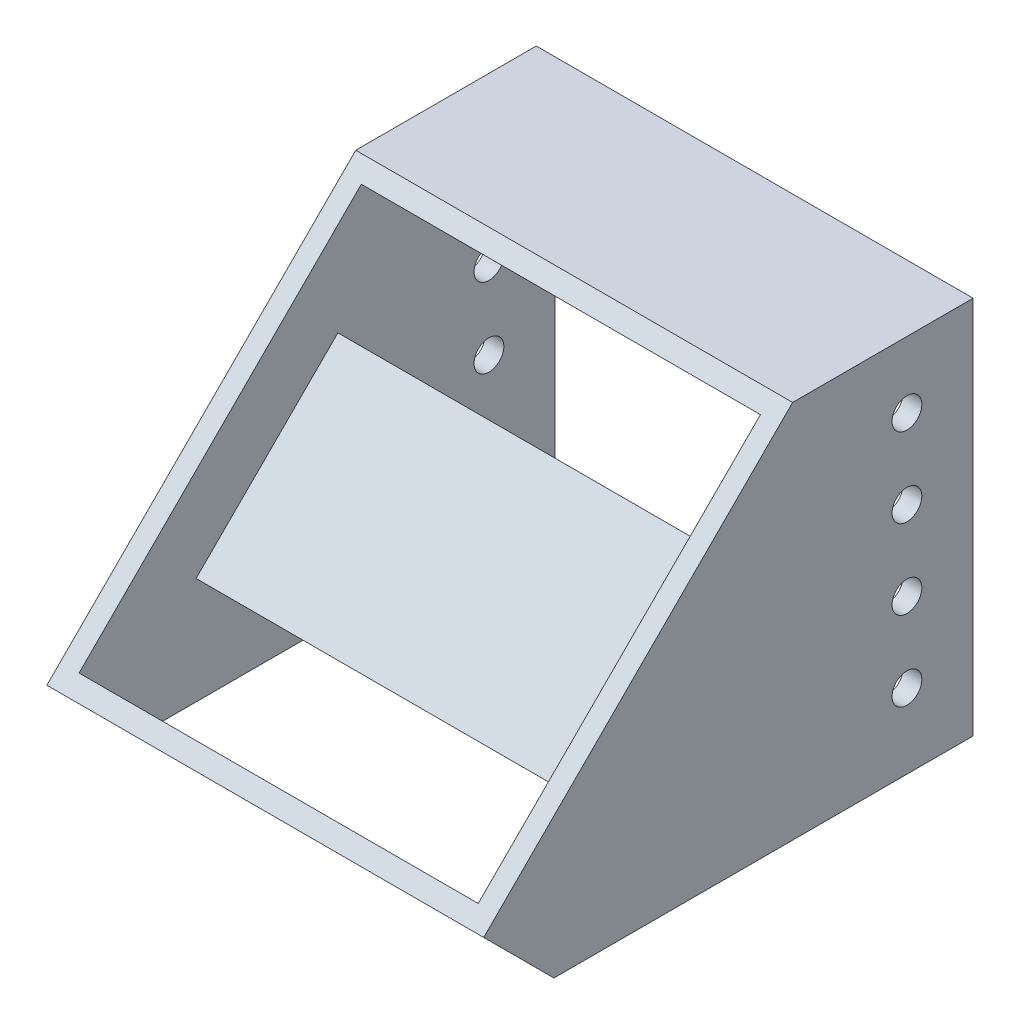
ISO-10303-21;
HEADER;
FILE_DESCRIPTION(('STEP AP214'),'2;1');
FILE_NAME('part.step','',(''),(''),'','','');
FILE_SCHEMA(('AUTOMOTIVE_DESIGN { 1 0 10303 214 1 1 1 1 }'));
ENDSEC;
DATA;
#1=APPLICATION_CONTEXT('core data for automotive mechanical design processes');
#2=APPLICATION_PROTOCOL_DEFINITION('international standard','automotive_design',2000,#1);
#3=PRODUCT_CONTEXT('',#1,'mechanical');
#4=PRODUCT('Part','Part','',(#3));
#5=PRODUCT_RELATED_PRODUCT_CATEGORY('part','',(#4));
#6=PRODUCT_DEFINITION_FORMATION('','',#4);
#7=PRODUCT_DEFINITION_CONTEXT('part definition',#1,'design');
#8=PRODUCT_DEFINITION('design','',#6,#7);
#9=PRODUCT_DEFINITION_SHAPE('','',#8);
#10=(LENGTH_UNIT() NAMED_UNIT(*) SI_UNIT(.MILLI.,.METRE.));
#11=(NAMED_UNIT(*) PLANE_ANGLE_UNIT() SI_UNIT($,.RADIAN.));
#12=(NAMED_UNIT(*) SI_UNIT($,.STERADIAN.) SOLID_ANGLE_UNIT());
#13=UNCERTAINTY_MEASURE_WITH_UNIT(LENGTH_MEASURE(1.E-05),#10,'distance_accuracy_value','');
#14=(GEOMETRIC_REPRESENTATION_CONTEXT(3) GLOBAL_UNCERTAINTY_ASSIGNED_CONTEXT((#13)) GLOBAL_UNIT_ASSIGNED_CONTEXT((#10,
#11,#12)) REPRESENTATION_CONTEXT('',''));
#15=CARTESIAN_POINT('',(0.,0.,0.));
#16=DIRECTION('',(0.,0.,1.));
#17=DIRECTION('',(1.,0.,0.));
#18=AXIS2_PLACEMENT_3D('',#15,#16,#17);
#19=CARTESIAN_POINT('',(-30.15,31.9258711705726,-10.7126677349762));
#20=DIRECTION('',(1.,0.,0.));
#21=DIRECTION('',(0.,0.,-1.));
#22=AXIS2_PLACEMENT_3D('',#19,#20,#21);
#23=PLANE('',#22);
#24=CARTESIAN_POINT('',(-30.15,23.9411254969543,-30.));
#25=DIRECTION('',(1.,0.,0.));
#26=DIRECTION('',(0.,0.,-1.));
#27=AXIS2_PLACEMENT_3D('',#24,#25,#26);
#28=CIRCLE('',#27,2.25);
#29=CARTESIAN_POINT('',(-30.15,23.9411254969543,-32.25));
#30=VERTEX_POINT('',#29);
#31=EDGE_CURVE('E166',#30,#30,#28,.T.);
#32=ORIENTED_EDGE('',*,*,#31,.F.);
#33=EDGE_LOOP('',(#32));
#34=FACE_BOUND('',#33,.T.);
#35=CARTESIAN_POINT('',(-30.15,-0.0588745030457236,-30.));
#36=DIRECTION('',(1.,0.,0.));
#37=DIRECTION('',(0.,0.,-1.));
#38=AXIS2_PLACEMENT_3D('',#35,#36,#37);
#39=CIRCLE('',#38,2.25);
#40=CARTESIAN_POINT('',(-30.15,-0.0588745030457236,-32.25));
#41=VERTEX_POINT('',#40);
#42=EDGE_CURVE('E294',#41,#41,#39,.T.);
#43=ORIENTED_EDGE('',*,*,#42,.F.);
#44=EDGE_LOOP('',(#43));
#45=FACE_BOUND('',#44,.T.);
#46=CARTESIAN_POINT('',(-30.15,11.9411254969543,-30.));
#47=DIRECTION('',(1.,0.,0.));
#48=DIRECTION('',(0.,0.,-1.));
#49=AXIS2_PLACEMENT_3D('',#46,#47,#48);
#50=CIRCLE('',#49,2.25);
#51=CARTESIAN_POINT('',(-30.15,11.9411254969543,-32.25));
#52=VERTEX_POINT('',#51);
#53=EDGE_CURVE('E303',#52,#52,#50,.T.);
#54=ORIENTED_EDGE('',*,*,#53,.F.);
#55=EDGE_LOOP('',(#54));
#56=FACE_BOUND('',#55,.T.);
#57=CARTESIAN_POINT('',(-30.15,-12.0588745030457,-30.));
#58=DIRECTION('',(1.,0.,0.));
#59=DIRECTION('',(0.,0.,-1.));
#60=AXIS2_PLACEMENT_3D('',#57,#58,#59);
#61=CIRCLE('',#60,2.25);
#62=CARTESIAN_POINT('',(-30.15,-12.0588745030457,-32.25));
#63=VERTEX_POINT('',#62);
#64=EDGE_CURVE('E312',#63,#63,#61,.T.);
#65=ORIENTED_EDGE('',*,*,#64,.F.);
#66=EDGE_LOOP('',(#65));
#67=FACE_BOUND('',#66,.T.);
#68=DIRECTION('',(0.,0.,-1.));
#69=VECTOR('',#68,1.);
#70=CARTESIAN_POINT('',(-30.15,30.9411254969543,62.660050782245));
#71=LINE('',#70,#69);
#72=CARTESIAN_POINT('',(-30.15,30.9411254969543,-11.6974134085946));
#73=VERTEX_POINT('',#72);
#74=CARTESIAN_POINT('',(-30.15,30.9411254969543,-40.));
#75=VERTEX_POINT('',#74);
#76=EDGE_CURVE('E50',#73,#75,#71,.T.);
#77=ORIENTED_EDGE('',*,*,#76,.F.);
#78=DIRECTION('',(0.,-0.707106781186548,-0.707106781186548));
#79=VECTOR('',#78,1.);
#80=CARTESIAN_POINT('',(-30.15,31.9258711705726,-10.7126677349762));
#81=LINE('',#80,#79);
#82=CARTESIAN_POINT('',(-30.15,31.9258711705726,-10.7126677349762));
#83=VERTEX_POINT('',#82);
#84=EDGE_CURVE('E165',#83,#73,#81,.T.);
#85=ORIENTED_EDGE('',*,*,#84,.F.);
#86=DIRECTION('',(0.,-0.707106781186547,0.707106781186547));
#87=VECTOR('',#86,1.);
#88=CARTESIAN_POINT('',(-30.15,31.9258711705726,-10.7126677349762));
#89=LINE('',#88,#87);
#90=CARTESIAN_POINT('',(-30.15,-10.7126677349762,31.9258711705726));
#91=VERTEX_POINT('',#90);
#92=EDGE_CURVE('E220',#83,#91,#89,.T.);
#93=ORIENTED_EDGE('',*,*,#92,.T.);
#94=DIRECTION('',(0.,-0.707106781186548,-0.707106781186548));
#95=VECTOR('',#94,1.);
#96=CARTESIAN_POINT('',(-30.15,-10.7126677349762,31.9258711705726));
#97=LINE('',#96,#95);
#98=CARTESIAN_POINT('',(-30.15,-21.3192694527744,21.3192694527744));
#99=VERTEX_POINT('',#98);
#100=EDGE_CURVE('E174',#91,#99,#97,.T.);
#101=ORIENTED_EDGE('',*,*,#100,.T.);
#102=DIRECTION('',(0.,0.707106781186548,-0.707106781186547));
#103=VECTOR('',#102,1.);
#104=CARTESIAN_POINT('',(-30.15,-31.960031650134,31.960031650134));
#105=LINE('',#104,#103);
#106=CARTESIAN_POINT('',(-30.15,-23.3345237791561,23.3345237791561));
#107=VERTEX_POINT('',#106);
#108=EDGE_CURVE('E242',#107,#99,#105,.T.);
#109=ORIENTED_EDGE('',*,*,#108,.F.);
#110=DIRECTION('',(0.,0.,-1.));
#111=VECTOR('',#110,1.);
#112=CARTESIAN_POINT('',(-30.15,-23.3345237791561,63.920063300268));
#113=LINE('',#112,#111);
#114=CARTESIAN_POINT('',(-30.15,-23.3345237791561,-40.));
#115=VERTEX_POINT('',#114);
#116=EDGE_CURVE('E250',#107,#115,#113,.T.);
#117=ORIENTED_EDGE('',*,*,#116,.T.);
#118=DIRECTION('',(0.,-1.,0.));
#119=VECTOR('',#118,1.);
#120=CARTESIAN_POINT('',(-30.15,0.,-40.));
#121=LINE('',#120,#119);
#122=EDGE_CURVE('E261',#75,#115,#121,.T.);
#123=ORIENTED_EDGE('',*,*,#122,.F.);
#124=EDGE_LOOP('',(#77,#85,#93,#101,#109,#117,#123));
#125=FACE_BOUND('',#124,.T.);
#126=CARTESIAN_POINT('',(-30.15,-10.7126677349762,10.7126677349762));
#127=VERTEX_POINT('',#126);
#128=CARTESIAN_POINT('',(-30.15,10.7126677349762,-10.7126677349762));
#129=VERTEX_POINT('',#128);
#130=EDGE_CURVE('E246',#127,#129,#105,.T.);
#131=ORIENTED_EDGE('',*,*,#130,.F.);
#132=DIRECTION('',(0.,0.707106781186548,0.707106781186548));
#133=VECTOR('',#132,1.);
#134=CARTESIAN_POINT('',(-30.15,-34.0471915141323,-12.6218560441799));
#135=LINE('',#134,#133);
#136=CARTESIAN_POINT('',(-30.15,-7.17713382904345,14.2482016409089));
#137=VERTEX_POINT('',#136);
#138=EDGE_CURVE('E237',#127,#137,#135,.T.);
#139=ORIENTED_EDGE('',*,*,#138,.T.);
#140=DIRECTION('',(0.,-0.707106781186547,0.707106781186547));
#141=VECTOR('',#140,1.);
#142=CARTESIAN_POINT('',(-30.15,24.8548033587072,-17.7837355468417));
#143=LINE('',#142,#141);
#144=CARTESIAN_POINT('',(-30.15,14.248201640909,-7.17713382904347));
#145=VERTEX_POINT('',#144);
#146=EDGE_CURVE('E211',#145,#137,#143,.T.);
#147=ORIENTED_EDGE('',*,*,#146,.F.);
#148=DIRECTION('',(0.,0.707106781186548,0.707106781186548));
#149=VECTOR('',#148,1.);
#150=CARTESIAN_POINT('',(-30.15,-12.6218560441799,-34.0471915141323));
#151=LINE('',#150,#149);
#152=EDGE_CURVE('E239',#129,#145,#151,.T.);
#153=ORIENTED_EDGE('',*,*,#152,.F.);
#154=EDGE_LOOP('',(#131,#139,#147,#153));
#155=FACE_BOUND('',#154,.T.);
#156=ADVANCED_FACE('F35',(#34,#45,#56,#67,#125,#155),#23,.T.);
#157=CARTESIAN_POINT('',(30.15,31.9258711705726,-10.7126677349762));
#158=DIRECTION('',(-1.,0.,0.));
#159=DIRECTION('',(0.,0.,1.));
#160=AXIS2_PLACEMENT_3D('',#157,#158,#159);
#161=PLANE('',#160);
#162=CARTESIAN_POINT('',(30.15,23.9411254969543,-30.));
#163=DIRECTION('',(-1.,0.,0.));
#164=DIRECTION('',(0.,0.,1.));
#165=AXIS2_PLACEMENT_3D('',#162,#163,#164);
#166=CIRCLE('',#165,2.25);
#167=CARTESIAN_POINT('',(30.15,23.9411254969543,-27.75));
#168=VERTEX_POINT('',#167);
#169=EDGE_CURVE('E288',#168,#168,#166,.T.);
#170=ORIENTED_EDGE('',*,*,#169,.F.);
#171=EDGE_LOOP('',(#170));
#172=FACE_BOUND('',#171,.T.);
#173=CARTESIAN_POINT('',(30.15,-0.0588745030457236,-30.));
#174=DIRECTION('',(-1.,0.,0.));
#175=DIRECTION('',(0.,0.,1.));
#176=AXIS2_PLACEMENT_3D('',#173,#174,#175);
#177=CIRCLE('',#176,2.25);
#178=CARTESIAN_POINT('',(30.15,-0.0588745030457236,-27.75));
#179=VERTEX_POINT('',#178);
#180=EDGE_CURVE('E297',#179,#179,#177,.T.);
#181=ORIENTED_EDGE('',*,*,#180,.F.);
#182=EDGE_LOOP('',(#181));
#183=FACE_BOUND('',#182,.T.);
#184=CARTESIAN_POINT('',(30.15,11.9411254969543,-30.));
#185=DIRECTION('',(-1.,0.,0.));
#186=DIRECTION('',(0.,0.,1.));
#187=AXIS2_PLACEMENT_3D('',#184,#185,#186);
#188=CIRCLE('',#187,2.25);
#189=CARTESIAN_POINT('',(30.15,11.9411254969543,-27.75));
#190=VERTEX_POINT('',#189);
#191=EDGE_CURVE('E306',#190,#190,#188,.T.);
#192=ORIENTED_EDGE('',*,*,#191,.F.);
#193=EDGE_LOOP('',(#192));
#194=FACE_BOUND('',#193,.T.);
#195=CARTESIAN_POINT('',(30.15,-12.0588745030457,-30.));
#196=DIRECTION('',(-1.,0.,0.));
#197=DIRECTION('',(0.,0.,1.));
#198=AXIS2_PLACEMENT_3D('',#195,#196,#197);
#199=CIRCLE('',#198,2.25);
#200=CARTESIAN_POINT('',(30.15,-12.0588745030457,-27.75));
#201=VERTEX_POINT('',#200);
#202=EDGE_CURVE('E315',#201,#201,#199,.T.);
#203=ORIENTED_EDGE('',*,*,#202,.F.);
#204=EDGE_LOOP('',(#203));
#205=FACE_BOUND('',#204,.T.);
#206=DIRECTION('',(0.,-0.707106781186548,-0.707106781186548));
#207=VECTOR('',#206,1.);
#208=CARTESIAN_POINT('',(30.15,31.9258711705726,-10.7126677349762));
#209=LINE('',#208,#207);
#210=CARTESIAN_POINT('',(30.15,31.9258711705726,-10.7126677349762));
#211=VERTEX_POINT('',#210);
#212=CARTESIAN_POINT('',(30.15,30.9411254969543,-11.6974134085946));
#213=VERTEX_POINT('',#212);
#214=EDGE_CURVE('E163',#211,#213,#209,.T.);
#215=ORIENTED_EDGE('',*,*,#214,.T.);
#216=DIRECTION('',(0.,0.,-1.));
#217=VECTOR('',#216,1.);
#218=CARTESIAN_POINT('',(30.15,30.9411254969543,62.660050782245));
#219=LINE('',#218,#217);
#220=CARTESIAN_POINT('',(30.15,30.9411254969543,-40.));
#221=VERTEX_POINT('',#220);
#222=EDGE_CURVE('E149',#213,#221,#219,.T.);
#223=ORIENTED_EDGE('',*,*,#222,.T.);
#224=DIRECTION('',(0.,-1.,0.));
#225=VECTOR('',#224,1.);
#226=CARTESIAN_POINT('',(30.15,0.,-40.));
#227=LINE('',#226,#225);
#228=CARTESIAN_POINT('',(30.15,-23.3345237791561,-40.));
#229=VERTEX_POINT('',#228);
#230=EDGE_CURVE('E279',#221,#229,#227,.T.);
#231=ORIENTED_EDGE('',*,*,#230,.T.);
#232=DIRECTION('',(0.,0.,-1.));
#233=VECTOR('',#232,1.);
#234=CARTESIAN_POINT('',(30.15,-23.3345237791561,63.920063300268));
#235=LINE('',#234,#233);
#236=CARTESIAN_POINT('',(30.15,-23.3345237791561,23.3345237791561));
#237=VERTEX_POINT('',#236);
#238=EDGE_CURVE('E271',#237,#229,#235,.T.);
#239=ORIENTED_EDGE('',*,*,#238,.F.);
#240=DIRECTION('',(0.,0.707106781186548,-0.707106781186547));
#241=VECTOR('',#240,1.);
#242=CARTESIAN_POINT('',(30.15,-31.960031650134,31.960031650134));
#243=LINE('',#242,#241);
#244=CARTESIAN_POINT('',(30.15,-21.3192694527744,21.3192694527744));
#245=VERTEX_POINT('',#244);
#246=EDGE_CURVE('E58',#237,#245,#243,.T.);
#247=ORIENTED_EDGE('',*,*,#246,.T.);
#248=DIRECTION('',(0.,-0.707106781186548,-0.707106781186548));
#249=VECTOR('',#248,1.);
#250=CARTESIAN_POINT('',(30.15,-10.7126677349762,31.9258711705726));
#251=LINE('',#250,#249);
#252=CARTESIAN_POINT('',(30.15,-10.7126677349762,31.9258711705726));
#253=VERTEX_POINT('',#252);
#254=EDGE_CURVE('E172',#253,#245,#251,.T.);
#255=ORIENTED_EDGE('',*,*,#254,.F.);
#256=DIRECTION('',(0.,0.707106781186547,-0.707106781186547));
#257=VECTOR('',#256,1.);
#258=CARTESIAN_POINT('',(30.15,31.9258711705726,-10.7126677349762));
#259=LINE('',#258,#257);
#260=EDGE_CURVE('E171',#253,#211,#259,.T.);
#261=ORIENTED_EDGE('',*,*,#260,.T.);
#262=EDGE_LOOP('',(#215,#223,#231,#239,#247,#255,#261));
#263=FACE_BOUND('',#262,.T.);
#264=CARTESIAN_POINT('',(30.15,-10.7126677349762,10.7126677349762));
#265=VERTEX_POINT('',#264);
#266=CARTESIAN_POINT('',(30.15,10.7126677349762,-10.7126677349762));
#267=VERTEX_POINT('',#266);
#268=EDGE_CURVE('E267',#265,#267,#243,.T.);
#269=ORIENTED_EDGE('',*,*,#268,.T.);
#270=DIRECTION('',(0.,0.707106781186548,0.707106781186548));
#271=VECTOR('',#270,1.);
#272=CARTESIAN_POINT('',(30.15,-12.6218560441799,-34.0471915141323));
#273=LINE('',#272,#271);
#274=CARTESIAN_POINT('',(30.15,14.248201640909,-7.17713382904347));
#275=VERTEX_POINT('',#274);
#276=EDGE_CURVE('E218',#267,#275,#273,.T.);
#277=ORIENTED_EDGE('',*,*,#276,.T.);
#278=DIRECTION('',(0.,0.707106781186547,-0.707106781186547));
#279=VECTOR('',#278,1.);
#280=CARTESIAN_POINT('',(30.15,24.8548033587072,-17.7837355468417));
#281=LINE('',#280,#279);
#282=CARTESIAN_POINT('',(30.15,-7.17713382904345,14.2482016409089));
#283=VERTEX_POINT('',#282);
#284=EDGE_CURVE('E209',#283,#275,#281,.T.);
#285=ORIENTED_EDGE('',*,*,#284,.F.);
#286=DIRECTION('',(0.,0.707106781186548,0.707106781186548));
#287=VECTOR('',#286,1.);
#288=CARTESIAN_POINT('',(30.15,-34.0471915141323,-12.6218560441799));
#289=LINE('',#288,#287);
#290=EDGE_CURVE('E216',#265,#283,#289,.T.);
#291=ORIENTED_EDGE('',*,*,#290,.F.);
#292=EDGE_LOOP('',(#269,#277,#285,#291));
#293=FACE_BOUND('',#292,.T.);
#294=ADVANCED_FACE('F168',(#172,#183,#194,#205,#263,#293),#161,.T.);
#295=CARTESIAN_POINT('',(0.,0.,0.));
#296=DIRECTION('',(0.,-0.707106781186547,-0.707106781186548));
#297=DIRECTION('',(0.,0.707106781186548,-0.707106781186547));
#298=AXIS2_PLACEMENT_3D('',#295,#296,#297);
#299=PLANE('',#298);
#300=DIRECTION('',(-1.,0.,0.));
#301=VECTOR('',#300,1.);
#302=CARTESIAN_POINT('',(0.,10.7126677349762,-10.7126677349762));
#303=LINE('',#302,#301);
#304=EDGE_CURVE('E223',#267,#129,#303,.T.);
#305=ORIENTED_EDGE('',*,*,#304,.F.);
#306=ORIENTED_EDGE('',*,*,#268,.F.);
#307=DIRECTION('',(1.,0.,0.));
#308=VECTOR('',#307,1.);
#309=CARTESIAN_POINT('',(0.,-10.7126677349762,10.7126677349762));
#310=LINE('',#309,#308);
#311=EDGE_CURVE('E231',#127,#265,#310,.T.);
#312=ORIENTED_EDGE('',*,*,#311,.F.);
#313=ORIENTED_EDGE('',*,*,#130,.T.);
#314=EDGE_LOOP('',(#305,#306,#312,#313));
#315=FACE_BOUND('',#314,.T.);
#316=ADVANCED_FACE('F364',(#315),#299,.T.);
#317=DIRECTION('',(-1.,0.,0.));
#318=VECTOR('',#317,1.);
#319=CARTESIAN_POINT('',(0.,-21.3192694527744,21.3192694527744));
#320=LINE('',#319,#318);
#321=EDGE_CURVE('E234',#245,#99,#320,.T.);
#322=ORIENTED_EDGE('',*,*,#321,.F.);
#323=ORIENTED_EDGE('',*,*,#246,.F.);
#324=DIRECTION('',(1.,0.,0.));
#325=VECTOR('',#324,1.);
#326=CARTESIAN_POINT('',(33.,-23.3345237791561,23.3345237791561));
#327=LINE('',#326,#325);
#328=EDGE_CURVE('E194',#107,#237,#327,.T.);
#329=ORIENTED_EDGE('',*,*,#328,.F.);
#330=ORIENTED_EDGE('',*,*,#108,.T.);
#331=EDGE_LOOP('',(#322,#323,#329,#330));
#332=FACE_BOUND('',#331,.T.);
#333=ADVANCED_FACE('F381',(#332),#299,.T.);
#334=CARTESIAN_POINT('',(-33.,26.8700576850888,-19.7989898732233));
#335=DIRECTION('',(1.,0.,0.));
#336=DIRECTION('',(0.,0.,-1.));
#337=AXIS2_PLACEMENT_3D('',#334,#335,#336);
#338=PLANE('',#337);
#339=CARTESIAN_POINT('',(-33.,23.9411254969543,-30.));
#340=DIRECTION('',(1.,0.,0.));
#341=DIRECTION('',(0.,0.,-1.));
#342=AXIS2_PLACEMENT_3D('',#339,#340,#341);
#343=CIRCLE('',#342,2.25);
#344=CARTESIAN_POINT('',(-33.,23.9411254969543,-32.25));
#345=VERTEX_POINT('',#344);
#346=EDGE_CURVE('E291',#345,#345,#343,.T.);
#347=ORIENTED_EDGE('',*,*,#346,.T.);
#348=EDGE_LOOP('',(#347));
#349=FACE_BOUND('',#348,.T.);
#350=CARTESIAN_POINT('',(-33.,-0.0588745030457236,-30.));
#351=DIRECTION('',(1.,0.,0.));
#352=DIRECTION('',(0.,0.,-1.));
#353=AXIS2_PLACEMENT_3D('',#350,#351,#352);
#354=CIRCLE('',#353,2.25);
#355=CARTESIAN_POINT('',(-33.,-0.0588745030457236,-32.25));
#356=VERTEX_POINT('',#355);
#357=EDGE_CURVE('E300',#356,#356,#354,.T.);
#358=ORIENTED_EDGE('',*,*,#357,.T.);
#359=EDGE_LOOP('',(#358));
#360=FACE_BOUND('',#359,.T.);
#361=CARTESIAN_POINT('',(-33.,11.9411254969543,-30.));
#362=DIRECTION('',(1.,0.,0.));
#363=DIRECTION('',(0.,0.,-1.));
#364=AXIS2_PLACEMENT_3D('',#361,#362,#363);
#365=CIRCLE('',#364,2.25);
#366=CARTESIAN_POINT('',(-33.,11.9411254969543,-32.25));
#367=VERTEX_POINT('',#366);
#368=EDGE_CURVE('E309',#367,#367,#365,.T.);
#369=ORIENTED_EDGE('',*,*,#368,.T.);
#370=EDGE_LOOP('',(#369));
#371=FACE_BOUND('',#370,.T.);
#372=CARTESIAN_POINT('',(-33.,-12.0588745030457,-30.));
#373=DIRECTION('',(1.,0.,0.));
#374=DIRECTION('',(0.,0.,-1.));
#375=AXIS2_PLACEMENT_3D('',#372,#373,#374);
#376=CIRCLE('',#375,2.25);
#377=CARTESIAN_POINT('',(-33.,-12.0588745030457,-32.25));
#378=VERTEX_POINT('',#377);
#379=EDGE_CURVE('E318',#378,#378,#376,.T.);
#380=ORIENTED_EDGE('',*,*,#379,.T.);
#381=EDGE_LOOP('',(#380));
#382=FACE_BOUND('',#381,.T.);
#383=DIRECTION('',(0.,-1.,0.));
#384=VECTOR('',#383,1.);
#385=CARTESIAN_POINT('',(-33.,0.,-40.));
#386=LINE('',#385,#384);
#387=CARTESIAN_POINT('',(-33.,33.9411254969543,-40.));
#388=VERTEX_POINT('',#387);
#389=CARTESIAN_POINT('',(-33.,-23.3345237791561,-40.));
#390=VERTEX_POINT('',#389);
#391=EDGE_CURVE('E256',#388,#390,#386,.T.);
#392=ORIENTED_EDGE('',*,*,#391,.T.);
#393=DIRECTION('',(0.,0.,-1.));
#394=VECTOR('',#393,1.);
#395=CARTESIAN_POINT('',(-33.,-23.3345237791561,63.920063300268));
#396=LINE('',#395,#394);
#397=CARTESIAN_POINT('',(-33.,-23.3345237791561,23.3345237791561));
#398=VERTEX_POINT('',#397);
#399=EDGE_CURVE('E247',#398,#390,#396,.T.);
#400=ORIENTED_EDGE('',*,*,#399,.F.);
#401=DIRECTION('',(0.,-0.707106781186547,-0.707106781186548));
#402=VECTOR('',#401,1.);
#403=CARTESIAN_POINT('',(-33.,-19.7989898732233,26.8700576850888));
#404=LINE('',#403,#402);
#405=CARTESIAN_POINT('',(-33.,-12.7279220613579,33.9411254969543));
#406=VERTEX_POINT('',#405);
#407=EDGE_CURVE('E201',#406,#398,#404,.T.);
#408=ORIENTED_EDGE('',*,*,#407,.F.);
#409=DIRECTION('',(0.,-0.707106781186547,0.707106781186547));
#410=VECTOR('',#409,1.);
#411=CARTESIAN_POINT('',(-33.,33.9411254969543,-12.7279220613578));
#412=LINE('',#411,#410);
#413=CARTESIAN_POINT('',(-33.,33.9411254969543,-12.7279220613578));
#414=VERTEX_POINT('',#413);
#415=EDGE_CURVE('E191',#414,#406,#412,.T.);
#416=ORIENTED_EDGE('',*,*,#415,.F.);
#417=DIRECTION('',(0.,0.,-1.));
#418=VECTOR('',#417,1.);
#419=CARTESIAN_POINT('',(-33.,33.9411254969543,63.920063300268));
#420=LINE('',#419,#418);
#421=EDGE_CURVE('E244',#414,#388,#420,.T.);
#422=ORIENTED_EDGE('',*,*,#421,.T.);
#423=EDGE_LOOP('',(#392,#400,#408,#416,#422));
#424=FACE_BOUND('',#423,.T.);
#425=ADVANCED_FACE('F37',(#349,#360,#371,#382,#424),#338,.F.);
#426=CARTESIAN_POINT('',(33.,-19.7989898732233,26.8700576850888));
#427=DIRECTION('',(0.,0.707106781186548,-0.707106781186547));
#428=DIRECTION('',(0.,0.707106781186547,0.707106781186548));
#429=AXIS2_PLACEMENT_3D('',#426,#427,#428);
#430=PLANE('',#429);
#431=EDGE_CURVE('E195',#398,#107,#327,.T.);
#432=ORIENTED_EDGE('',*,*,#431,.T.);
#433=ORIENTED_EDGE('',*,*,#328,.T.);
#434=DIRECTION('',(-1.,0.,0.));
#435=VECTOR('',#434,1.);
#436=CARTESIAN_POINT('',(0.,-23.334523779156,23.334523779156));
#437=LINE('',#436,#435);
#438=CARTESIAN_POINT('',(33.,-23.3345237791561,23.3345237791561));
#439=VERTEX_POINT('',#438);
#440=EDGE_CURVE('E264',#439,#237,#437,.T.);
#441=ORIENTED_EDGE('',*,*,#440,.F.);
#442=DIRECTION('',(0.,-0.707106781186547,-0.707106781186548));
#443=VECTOR('',#442,1.);
#444=CARTESIAN_POINT('',(33.,-19.7989898732233,26.8700576850888));
#445=LINE('',#444,#443);
#446=CARTESIAN_POINT('',(33.,-12.7279220613579,33.9411254969543));
#447=VERTEX_POINT('',#446);
#448=EDGE_CURVE('E198',#447,#439,#445,.T.);
#449=ORIENTED_EDGE('',*,*,#448,.F.);
#450=DIRECTION('',(1.,0.,0.));
#451=VECTOR('',#450,1.);
#452=CARTESIAN_POINT('',(-33.,-12.7279220613579,33.9411254969543));
#453=LINE('',#452,#451);
#454=EDGE_CURVE('E182',#406,#447,#453,.T.);
#455=ORIENTED_EDGE('',*,*,#454,.F.);
#456=ORIENTED_EDGE('',*,*,#407,.T.);
#457=EDGE_LOOP('',(#432,#433,#441,#449,#455,#456));
#458=FACE_BOUND('',#457,.T.);
#459=ADVANCED_FACE('F384',(#458),#430,.F.);
#460=CARTESIAN_POINT('',(33.,26.8700576850888,-19.7989898732233));
#461=DIRECTION('',(-1.,0.,0.));
#462=DIRECTION('',(0.,-1.,0.));
#463=AXIS2_PLACEMENT_3D('',#460,#461,#462);
#464=PLANE('',#463);
#465=CARTESIAN_POINT('',(33.,23.9411254969543,-30.));
#466=DIRECTION('',(-1.,0.,0.));
#467=DIRECTION('',(0.,0.,1.));
#468=AXIS2_PLACEMENT_3D('',#465,#466,#467);
#469=CIRCLE('',#468,2.25);
#470=CARTESIAN_POINT('',(33.,23.9411254969543,-27.75));
#471=VERTEX_POINT('',#470);
#472=EDGE_CURVE('E321',#471,#471,#469,.T.);
#473=ORIENTED_EDGE('',*,*,#472,.T.);
#474=EDGE_LOOP('',(#473));
#475=FACE_BOUND('',#474,.T.);
#476=CARTESIAN_POINT('',(33.,-0.0588745030457236,-30.));
#477=DIRECTION('',(-1.,0.,0.));
#478=DIRECTION('',(0.,0.,1.));
#479=AXIS2_PLACEMENT_3D('',#476,#477,#478);
#480=CIRCLE('',#479,2.25);
#481=CARTESIAN_POINT('',(33.,-0.0588745030457236,-27.75));
#482=VERTEX_POINT('',#481);
#483=EDGE_CURVE('E326',#482,#482,#480,.T.);
#484=ORIENTED_EDGE('',*,*,#483,.T.);
#485=EDGE_LOOP('',(#484));
#486=FACE_BOUND('',#485,.T.);
#487=CARTESIAN_POINT('',(33.,11.9411254969543,-30.));
#488=DIRECTION('',(-1.,0.,0.));
#489=DIRECTION('',(0.,0.,1.));
#490=AXIS2_PLACEMENT_3D('',#487,#488,#489);
#491=CIRCLE('',#490,2.25);
#492=CARTESIAN_POINT('',(33.,11.9411254969543,-27.75));
#493=VERTEX_POINT('',#492);
#494=EDGE_CURVE('E322',#493,#493,#491,.T.);
#495=ORIENTED_EDGE('',*,*,#494,.T.);
#496=EDGE_LOOP('',(#495));
#497=FACE_BOUND('',#496,.T.);
#498=CARTESIAN_POINT('',(33.,-12.0588745030457,-30.));
#499=DIRECTION('',(-1.,0.,0.));
#500=DIRECTION('',(0.,0.,1.));
#501=AXIS2_PLACEMENT_3D('',#498,#499,#500);
#502=CIRCLE('',#501,2.25);
#503=CARTESIAN_POINT('',(33.,-12.0588745030457,-27.75));
#504=VERTEX_POINT('',#503);
#505=EDGE_CURVE('E325',#504,#504,#502,.T.);
#506=ORIENTED_EDGE('',*,*,#505,.T.);
#507=EDGE_LOOP('',(#506));
#508=FACE_BOUND('',#507,.T.);
#509=DIRECTION('',(0.,1.,0.));
#510=VECTOR('',#509,1.);
#511=CARTESIAN_POINT('',(33.,0.,-40.));
#512=LINE('',#511,#510);
#513=CARTESIAN_POINT('',(33.,-23.3345237791561,-40.));
#514=VERTEX_POINT('',#513);
#515=CARTESIAN_POINT('',(33.,33.9411254969543,-40.));
#516=VERTEX_POINT('',#515);
#517=EDGE_CURVE('E158',#514,#516,#512,.T.);
#518=ORIENTED_EDGE('',*,*,#517,.T.);
#519=DIRECTION('',(0.,0.,-1.));
#520=VECTOR('',#519,1.);
#521=CARTESIAN_POINT('',(33.,33.9411254969543,63.920063300268));
#522=LINE('',#521,#520);
#523=CARTESIAN_POINT('',(33.,33.9411254969543,-12.7279220613578));
#524=VERTEX_POINT('',#523);
#525=EDGE_CURVE('E268',#524,#516,#522,.T.);
#526=ORIENTED_EDGE('',*,*,#525,.F.);
#527=DIRECTION('',(0.,0.707106781186548,-0.707106781186548));
#528=VECTOR('',#527,1.);
#529=CARTESIAN_POINT('',(33.,-12.7279220613579,33.9411254969543));
#530=LINE('',#529,#528);
#531=EDGE_CURVE('E185',#447,#524,#530,.T.);
#532=ORIENTED_EDGE('',*,*,#531,.F.);
#533=ORIENTED_EDGE('',*,*,#448,.T.);
#534=DIRECTION('',(0.,0.,-1.));
#535=VECTOR('',#534,1.);
#536=CARTESIAN_POINT('',(33.,-23.3345237791561,63.920063300268));
#537=LINE('',#536,#535);
#538=EDGE_CURVE('E274',#439,#514,#537,.T.);
#539=ORIENTED_EDGE('',*,*,#538,.T.);
#540=EDGE_LOOP('',(#518,#526,#532,#533,#539));
#541=FACE_BOUND('',#540,.T.);
#542=ADVANCED_FACE('F334',(#475,#486,#497,#508,#541),#464,.F.);
#543=CARTESIAN_POINT('',(0.,10.6066017177982,10.6066017177982));
#544=DIRECTION('',(0.,0.707106781186548,0.707106781186548));
#545=DIRECTION('',(0.,-0.707106781186548,0.707106781186548));
#546=AXIS2_PLACEMENT_3D('',#543,#544,#545);
#547=PLANE('',#546);
#548=ORIENTED_EDGE('',*,*,#454,.T.);
#549=ORIENTED_EDGE('',*,*,#531,.T.);
#550=DIRECTION('',(-1.,0.,0.));
#551=VECTOR('',#550,1.);
#552=CARTESIAN_POINT('',(33.,33.9411254969543,-12.7279220613579));
#553=LINE('',#552,#551);
#554=EDGE_CURVE('E188',#524,#414,#553,.T.);
#555=ORIENTED_EDGE('',*,*,#554,.T.);
#556=ORIENTED_EDGE('',*,*,#415,.T.);
#557=EDGE_LOOP('',(#548,#549,#555,#556));
#558=FACE_BOUND('',#557,.T.);
#559=DIRECTION('',(1.,0.,0.));
#560=VECTOR('',#559,1.);
#561=CARTESIAN_POINT('',(30.15,-10.7126677349762,31.9258711705726));
#562=LINE('',#561,#560);
#563=EDGE_CURVE('E221',#91,#253,#562,.T.);
#564=ORIENTED_EDGE('',*,*,#563,.F.);
#565=ORIENTED_EDGE('',*,*,#92,.F.);
#566=DIRECTION('',(-1.,0.,0.));
#567=VECTOR('',#566,1.);
#568=CARTESIAN_POINT('',(30.15,31.9258711705726,-10.7126677349762));
#569=LINE('',#568,#567);
#570=EDGE_CURVE('E176',#211,#83,#569,.T.);
#571=ORIENTED_EDGE('',*,*,#570,.F.);
#572=ORIENTED_EDGE('',*,*,#260,.F.);
#573=EDGE_LOOP('',(#564,#565,#571,#572));
#574=FACE_BOUND('',#573,.T.);
#575=ADVANCED_FACE('F372',(#558,#574),#547,.T.);
#576=CARTESIAN_POINT('',(30.15,-10.7126677349762,31.9258711705726));
#577=DIRECTION('',(0.,0.707106781186548,-0.707106781186548));
#578=DIRECTION('',(0.,0.707106781186548,0.707106781186548));
#579=AXIS2_PLACEMENT_3D('',#576,#577,#578);
#580=PLANE('',#579);
#581=ORIENTED_EDGE('',*,*,#254,.T.);
#582=ORIENTED_EDGE('',*,*,#321,.T.);
#583=ORIENTED_EDGE('',*,*,#100,.F.);
#584=ORIENTED_EDGE('',*,*,#563,.T.);
#585=EDGE_LOOP('',(#581,#582,#583,#584));
#586=FACE_BOUND('',#585,.T.);
#587=ADVANCED_FACE('F371',(#586),#580,.T.);
#588=CARTESIAN_POINT('',(30.15,31.9258711705726,-10.7126677349762));
#589=DIRECTION('',(0.,-0.707106781186548,0.707106781186548));
#590=DIRECTION('',(0.,-0.707106781186548,-0.707106781186548));
#591=AXIS2_PLACEMENT_3D('',#588,#589,#590);
#592=PLANE('',#591);
#593=DIRECTION('',(-1.,0.,0.));
#594=VECTOR('',#593,1.);
#595=CARTESIAN_POINT('',(30.15,30.9411254969543,-11.6974134085946));
#596=LINE('',#595,#594);
#597=EDGE_CURVE('E152',#213,#73,#596,.T.);
#598=ORIENTED_EDGE('',*,*,#597,.F.);
#599=ORIENTED_EDGE('',*,*,#214,.F.);
#600=ORIENTED_EDGE('',*,*,#570,.T.);
#601=ORIENTED_EDGE('',*,*,#84,.T.);
#602=EDGE_LOOP('',(#598,#599,#600,#601));
#603=FACE_BOUND('',#602,.T.);
#604=ADVANCED_FACE('F162',(#603),#592,.T.);
#605=CARTESIAN_POINT('',(0.,3.53553390593274,3.53553390593274));
#606=DIRECTION('',(0.,-0.707106781186547,-0.707106781186548));
#607=DIRECTION('',(0.,0.707106781186548,-0.707106781186547));
#608=AXIS2_PLACEMENT_3D('',#605,#606,#607);
#609=PLANE('',#608);
#610=ORIENTED_EDGE('',*,*,#284,.T.);
#611=DIRECTION('',(-1.,0.,0.));
#612=VECTOR('',#611,1.);
#613=CARTESIAN_POINT('',(0.,14.2482016409089,-7.17713382904347));
#614=LINE('',#613,#612);
#615=EDGE_CURVE('E11',#275,#145,#614,.T.);
#616=ORIENTED_EDGE('',*,*,#615,.T.);
#617=ORIENTED_EDGE('',*,*,#146,.T.);
#618=DIRECTION('',(1.,0.,0.));
#619=VECTOR('',#618,1.);
#620=CARTESIAN_POINT('',(0.,-7.17713382904346,14.2482016409089));
#621=LINE('',#620,#619);
#622=EDGE_CURVE('E43',#137,#283,#621,.T.);
#623=ORIENTED_EDGE('',*,*,#622,.T.);
#624=EDGE_LOOP('',(#610,#616,#617,#623));
#625=FACE_BOUND('',#624,.T.);
#626=ADVANCED_FACE('F208',(#625),#609,.F.);
#627=CARTESIAN_POINT('',(30.15,-34.0471915141323,-12.6218560441799));
#628=DIRECTION('',(0.,0.707106781186548,-0.707106781186548));
#629=DIRECTION('',(0.,0.707106781186548,0.707106781186548));
#630=AXIS2_PLACEMENT_3D('',#627,#628,#629);
#631=PLANE('',#630);
#632=ORIENTED_EDGE('',*,*,#311,.T.);
#633=ORIENTED_EDGE('',*,*,#290,.T.);
#634=ORIENTED_EDGE('',*,*,#622,.F.);
#635=ORIENTED_EDGE('',*,*,#138,.F.);
#636=EDGE_LOOP('',(#632,#633,#634,#635));
#637=FACE_BOUND('',#636,.T.);
#638=ADVANCED_FACE('F378',(#637),#631,.F.);
#639=CARTESIAN_POINT('',(-30.15,-12.6218560441799,-34.0471915141323));
#640=DIRECTION('',(0.,-0.707106781186548,0.707106781186548));
#641=DIRECTION('',(0.,-0.707106781186548,-0.707106781186548));
#642=AXIS2_PLACEMENT_3D('',#639,#640,#641);
#643=PLANE('',#642);
#644=ORIENTED_EDGE('',*,*,#304,.T.);
#645=ORIENTED_EDGE('',*,*,#152,.T.);
#646=ORIENTED_EDGE('',*,*,#615,.F.);
#647=ORIENTED_EDGE('',*,*,#276,.F.);
#648=EDGE_LOOP('',(#644,#645,#646,#647));
#649=FACE_BOUND('',#648,.T.);
#650=ADVANCED_FACE('F412',(#649),#643,.F.);
#651=CARTESIAN_POINT('',(0.,0.,-40.));
#652=DIRECTION('',(0.,0.,1.));
#653=DIRECTION('',(1.,0.,0.));
#654=AXIS2_PLACEMENT_3D('',#651,#652,#653);
#655=PLANE('',#654);
#656=ORIENTED_EDGE('',*,*,#122,.T.);
#657=DIRECTION('',(1.,0.,0.));
#658=VECTOR('',#657,1.);
#659=CARTESIAN_POINT('',(0.,-23.3345237791561,-40.));
#660=LINE('',#659,#658);
#661=EDGE_CURVE('E253',#390,#115,#660,.T.);
#662=ORIENTED_EDGE('',*,*,#661,.F.);
#663=ORIENTED_EDGE('',*,*,#391,.F.);
#664=DIRECTION('',(-1.,0.,0.));
#665=VECTOR('',#664,1.);
#666=CARTESIAN_POINT('',(0.,33.9411254969543,-40.));
#667=LINE('',#666,#665);
#668=EDGE_CURVE('E258',#516,#388,#667,.T.);
#669=ORIENTED_EDGE('',*,*,#668,.F.);
#670=ORIENTED_EDGE('',*,*,#517,.F.);
#671=DIRECTION('',(1.,0.,0.));
#672=VECTOR('',#671,1.);
#673=CARTESIAN_POINT('',(0.,-23.334523779156,-40.));
#674=LINE('',#673,#672);
#675=EDGE_CURVE('E276',#229,#514,#674,.T.);
#676=ORIENTED_EDGE('',*,*,#675,.F.);
#677=ORIENTED_EDGE('',*,*,#230,.F.);
#678=DIRECTION('',(1.,0.,0.));
#679=VECTOR('',#678,1.);
#680=CARTESIAN_POINT('',(-30.15,30.9411254969543,-40.));
#681=LINE('',#680,#679);
#682=EDGE_CURVE('E155',#75,#221,#681,.T.);
#683=ORIENTED_EDGE('',*,*,#682,.F.);
#684=EDGE_LOOP('',(#656,#662,#663,#669,#670,#676,#677,#683));
#685=FACE_BOUND('',#684,.T.);
#686=ADVANCED_FACE('F414',(#685),#655,.F.);
#687=CARTESIAN_POINT('',(0.,-23.3345237791561,63.920063300268));
#688=DIRECTION('',(0.,1.,0.));
#689=DIRECTION('',(0.,0.,1.));
#690=AXIS2_PLACEMENT_3D('',#687,#688,#689);
#691=PLANE('',#690);
#692=ORIENTED_EDGE('',*,*,#116,.F.);
#693=ORIENTED_EDGE('',*,*,#431,.F.);
#694=ORIENTED_EDGE('',*,*,#399,.T.);
#695=ORIENTED_EDGE('',*,*,#661,.T.);
#696=EDGE_LOOP('',(#692,#693,#694,#695));
#697=FACE_BOUND('',#696,.T.);
#698=ADVANCED_FACE('F398',(#697),#691,.F.);
#699=CARTESIAN_POINT('',(0.,33.9411254969543,63.920063300268));
#700=DIRECTION('',(0.,-1.,0.));
#701=DIRECTION('',(0.,0.,-1.));
#702=AXIS2_PLACEMENT_3D('',#699,#700,#701);
#703=PLANE('',#702);
#704=ORIENTED_EDGE('',*,*,#525,.T.);
#705=ORIENTED_EDGE('',*,*,#668,.T.);
#706=ORIENTED_EDGE('',*,*,#421,.F.);
#707=ORIENTED_EDGE('',*,*,#554,.F.);
#708=EDGE_LOOP('',(#704,#705,#706,#707));
#709=FACE_BOUND('',#708,.T.);
#710=ADVANCED_FACE('F424',(#709),#703,.F.);
#711=CARTESIAN_POINT('',(0.,-23.334523779156,63.920063300268));
#712=DIRECTION('',(0.,1.,0.));
#713=DIRECTION('',(-1.,0.,0.));
#714=AXIS2_PLACEMENT_3D('',#711,#712,#713);
#715=PLANE('',#714);
#716=ORIENTED_EDGE('',*,*,#538,.F.);
#717=ORIENTED_EDGE('',*,*,#440,.T.);
#718=ORIENTED_EDGE('',*,*,#238,.T.);
#719=ORIENTED_EDGE('',*,*,#675,.T.);
#720=EDGE_LOOP('',(#716,#717,#718,#719));
#721=FACE_BOUND('',#720,.T.);
#722=ADVANCED_FACE('F513',(#721),#715,.F.);
#723=CARTESIAN_POINT('',(-30.15,30.9411254969543,62.660050782245));
#724=DIRECTION('',(0.,1.,0.));
#725=DIRECTION('',(0.,0.,1.));
#726=AXIS2_PLACEMENT_3D('',#723,#724,#725);
#727=PLANE('',#726);
#728=ORIENTED_EDGE('',*,*,#222,.F.);
#729=ORIENTED_EDGE('',*,*,#597,.T.);
#730=ORIENTED_EDGE('',*,*,#76,.T.);
#731=ORIENTED_EDGE('',*,*,#682,.T.);
#732=EDGE_LOOP('',(#728,#729,#730,#731));
#733=FACE_BOUND('',#732,.T.);
#734=ADVANCED_FACE('F151',(#733),#727,.F.);
#735=CARTESIAN_POINT('',(33.,-12.0588745030457,-30.));
#736=DIRECTION('',(-1.,0.,0.));
#737=DIRECTION('',(0.,0.,1.));
#738=AXIS2_PLACEMENT_3D('',#735,#736,#737);
#739=CYLINDRICAL_SURFACE('',#738,2.25);
#740=ORIENTED_EDGE('',*,*,#202,.T.);
#741=EDGE_LOOP('',(#740));
#742=FACE_BOUND('',#741,.T.);
#743=ORIENTED_EDGE('',*,*,#505,.F.);
#744=EDGE_LOOP('',(#743));
#745=FACE_BOUND('',#744,.T.);
#746=ADVANCED_FACE('F351',(#742,#745),#739,.F.);
#747=CARTESIAN_POINT('',(33.,11.9411254969543,-30.));
#748=DIRECTION('',(-1.,0.,0.));
#749=DIRECTION('',(0.,0.,1.));
#750=AXIS2_PLACEMENT_3D('',#747,#748,#749);
#751=CYLINDRICAL_SURFACE('',#750,2.25);
#752=ORIENTED_EDGE('',*,*,#191,.T.);
#753=EDGE_LOOP('',(#752));
#754=FACE_BOUND('',#753,.T.);
#755=ORIENTED_EDGE('',*,*,#494,.F.);
#756=EDGE_LOOP('',(#755));
#757=FACE_BOUND('',#756,.T.);
#758=ADVANCED_FACE('F352',(#754,#757),#751,.F.);
#759=CARTESIAN_POINT('',(33.,-0.0588745030457236,-30.));
#760=DIRECTION('',(-1.,0.,0.));
#761=DIRECTION('',(0.,0.,1.));
#762=AXIS2_PLACEMENT_3D('',#759,#760,#761);
#763=CYLINDRICAL_SURFACE('',#762,2.25);
#764=ORIENTED_EDGE('',*,*,#180,.T.);
#765=EDGE_LOOP('',(#764));
#766=FACE_BOUND('',#765,.T.);
#767=ORIENTED_EDGE('',*,*,#483,.F.);
#768=EDGE_LOOP('',(#767));
#769=FACE_BOUND('',#768,.T.);
#770=ADVANCED_FACE('F340',(#766,#769),#763,.F.);
#771=CARTESIAN_POINT('',(33.,23.9411254969543,-30.));
#772=DIRECTION('',(-1.,0.,0.));
#773=DIRECTION('',(0.,0.,1.));
#774=AXIS2_PLACEMENT_3D('',#771,#772,#773);
#775=CYLINDRICAL_SURFACE('',#774,2.25);
#776=ORIENTED_EDGE('',*,*,#169,.T.);
#777=EDGE_LOOP('',(#776));
#778=FACE_BOUND('',#777,.T.);
#779=ORIENTED_EDGE('',*,*,#472,.F.);
#780=EDGE_LOOP('',(#779));
#781=FACE_BOUND('',#780,.T.);
#782=ADVANCED_FACE('F337',(#778,#781),#775,.F.);
#783=ORIENTED_EDGE('',*,*,#64,.T.);
#784=EDGE_LOOP('',(#783));
#785=FACE_BOUND('',#784,.T.);
#786=ORIENTED_EDGE('',*,*,#379,.F.);
#787=EDGE_LOOP('',(#786));
#788=FACE_BOUND('',#787,.T.);
#789=ADVANCED_FACE('F339',(#785,#788),#739,.F.);
#790=ORIENTED_EDGE('',*,*,#53,.T.);
#791=EDGE_LOOP('',(#790));
#792=FACE_BOUND('',#791,.T.);
#793=ORIENTED_EDGE('',*,*,#368,.F.);
#794=EDGE_LOOP('',(#793));
#795=FACE_BOUND('',#794,.T.);
#796=ADVANCED_FACE('F348',(#792,#795),#751,.F.);
#797=ORIENTED_EDGE('',*,*,#42,.T.);
#798=EDGE_LOOP('',(#797));
#799=FACE_BOUND('',#798,.T.);
#800=ORIENTED_EDGE('',*,*,#357,.F.);
#801=EDGE_LOOP('',(#800));
#802=FACE_BOUND('',#801,.T.);
#803=ADVANCED_FACE('F355',(#799,#802),#763,.F.);
#804=ORIENTED_EDGE('',*,*,#31,.T.);
#805=EDGE_LOOP('',(#804));
#806=FACE_BOUND('',#805,.T.);
#807=ORIENTED_EDGE('',*,*,#346,.F.);
#808=EDGE_LOOP('',(#807));
#809=FACE_BOUND('',#808,.T.);
#810=ADVANCED_FACE('F343',(#806,#809),#775,.F.);
#811=CLOSED_SHELL('',(#156,#294,#316,#333,#425,#459,#542,#575,#587,#604,#626,#638,#650,#686,
#698,#710,#722,#734,#746,#758,#770,#782,#789,#796,#803,#810));
#812=MANIFOLD_SOLID_BREP('B2',#811);
#813=ADVANCED_BREP_SHAPE_REPRESENTATION('',(#18,#812),#14);
#814=SHAPE_DEFINITION_REPRESENTATION(#9,#813);
ENDSEC;
END-ISO-10303-21;
